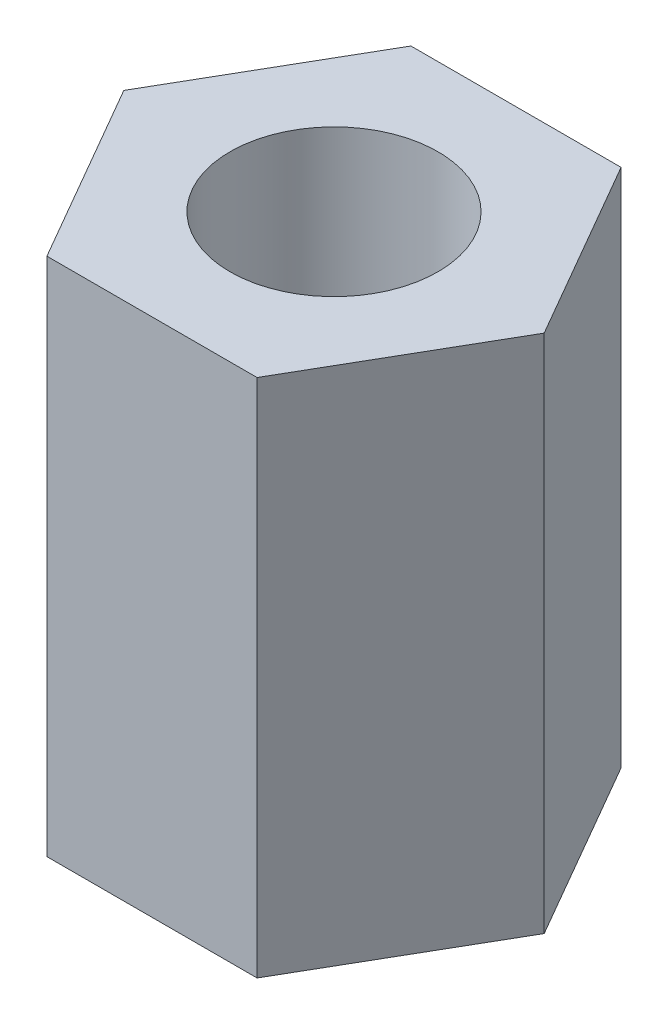
ISO-10303-21;
HEADER;
FILE_DESCRIPTION(('STEP AP214'),'2;1');
FILE_NAME('part.step','',(''),(''),'','','');
FILE_SCHEMA(('AUTOMOTIVE_DESIGN { 1 0 10303 214 1 1 1 1 }'));
ENDSEC;
DATA;
#1=APPLICATION_CONTEXT('core data for automotive mechanical design processes');
#2=APPLICATION_PROTOCOL_DEFINITION('international standard','automotive_design',2000,#1);
#3=PRODUCT_CONTEXT('',#1,'mechanical');
#4=PRODUCT('Part','Part','',(#3));
#5=PRODUCT_RELATED_PRODUCT_CATEGORY('part','',(#4));
#6=PRODUCT_DEFINITION_FORMATION('','',#4);
#7=PRODUCT_DEFINITION_CONTEXT('part definition',#1,'design');
#8=PRODUCT_DEFINITION('design','',#6,#7);
#9=PRODUCT_DEFINITION_SHAPE('','',#8);
#10=(LENGTH_UNIT() NAMED_UNIT(*) SI_UNIT(.MILLI.,.METRE.));
#11=(NAMED_UNIT(*) PLANE_ANGLE_UNIT() SI_UNIT($,.RADIAN.));
#12=(NAMED_UNIT(*) SI_UNIT($,.STERADIAN.) SOLID_ANGLE_UNIT());
#13=UNCERTAINTY_MEASURE_WITH_UNIT(LENGTH_MEASURE(1.E-05),#10,'distance_accuracy_value','');
#14=(GEOMETRIC_REPRESENTATION_CONTEXT(3) GLOBAL_UNCERTAINTY_ASSIGNED_CONTEXT((#13)) GLOBAL_UNIT_ASSIGNED_CONTEXT((#10,
#11,#12)) REPRESENTATION_CONTEXT('',''));
#15=CARTESIAN_POINT('',(0.,0.,0.));
#16=DIRECTION('',(0.,0.,1.));
#17=DIRECTION('',(1.,0.,0.));
#18=AXIS2_PLACEMENT_3D('',#15,#16,#17);
#19=CARTESIAN_POINT('',(0.,10.,0.));
#20=DIRECTION('',(0.,1.,0.));
#21=DIRECTION('',(0.,0.,1.));
#22=AXIS2_PLACEMENT_3D('',#19,#20,#21);
#23=PLANE('',#22);
#24=DIRECTION('',(0.5,0.,-0.866025403784439));
#25=VECTOR('',#24,1.);
#26=CARTESIAN_POINT('',(2.02072594216369,10.,3.5));
#27=LINE('',#26,#25);
#28=CARTESIAN_POINT('',(2.02072594216369,10.,3.5));
#29=VERTEX_POINT('',#28);
#30=CARTESIAN_POINT('',(4.04145188432738,10.,0.));
#31=VERTEX_POINT('',#30);
#32=EDGE_CURVE('E131',#29,#31,#27,.T.);
#33=ORIENTED_EDGE('',*,*,#32,.T.);
#34=DIRECTION('',(-0.5,0.,-0.866025403784439));
#35=VECTOR('',#34,1.);
#36=CARTESIAN_POINT('',(4.04145188432738,10.,0.));
#37=LINE('',#36,#35);
#38=CARTESIAN_POINT('',(2.02072594216369,10.,-3.5));
#39=VERTEX_POINT('',#38);
#40=EDGE_CURVE('E89',#31,#39,#37,.T.);
#41=ORIENTED_EDGE('',*,*,#40,.T.);
#42=DIRECTION('',(-1.,0.,0.));
#43=VECTOR('',#42,1.);
#44=CARTESIAN_POINT('',(2.02072594216369,10.,-3.5));
#45=LINE('',#44,#43);
#46=CARTESIAN_POINT('',(-2.02072594216369,10.,-3.5));
#47=VERTEX_POINT('',#46);
#48=EDGE_CURVE('E102',#39,#47,#45,.T.);
#49=ORIENTED_EDGE('',*,*,#48,.T.);
#50=DIRECTION('',(-0.5,0.,0.866025403784439));
#51=VECTOR('',#50,1.);
#52=CARTESIAN_POINT('',(-2.02072594216369,10.,-3.5));
#53=LINE('',#52,#51);
#54=CARTESIAN_POINT('',(-4.04145188432738,10.,0.));
#55=VERTEX_POINT('',#54);
#56=EDGE_CURVE('E96',#47,#55,#53,.T.);
#57=ORIENTED_EDGE('',*,*,#56,.T.);
#58=DIRECTION('',(0.5,0.,0.866025403784439));
#59=VECTOR('',#58,1.);
#60=CARTESIAN_POINT('',(-4.04145188432738,10.,0.));
#61=LINE('',#60,#59);
#62=CARTESIAN_POINT('',(-2.02072594216369,10.,3.5));
#63=VERTEX_POINT('',#62);
#64=EDGE_CURVE('E100',#55,#63,#61,.T.);
#65=ORIENTED_EDGE('',*,*,#64,.T.);
#66=DIRECTION('',(1.,0.,0.));
#67=VECTOR('',#66,1.);
#68=CARTESIAN_POINT('',(-2.02072594216369,10.,3.5));
#69=LINE('',#68,#67);
#70=EDGE_CURVE('E52',#63,#29,#69,.T.);
#71=ORIENTED_EDGE('',*,*,#70,.T.);
#72=EDGE_LOOP('',(#33,#41,#49,#57,#65,#71));
#73=FACE_BOUND('',#72,.T.);
#74=CARTESIAN_POINT('',(0.,10.,0.));
#75=DIRECTION('',(0.,1.,0.));
#76=DIRECTION('',(0.,0.,1.));
#77=AXIS2_PLACEMENT_3D('',#74,#75,#76);
#78=CIRCLE('',#77,2.);
#79=CARTESIAN_POINT('',(0.,10.,2.));
#80=VERTEX_POINT('',#79);
#81=EDGE_CURVE('E124',#80,#80,#78,.T.);
#82=ORIENTED_EDGE('',*,*,#81,.F.);
#83=EDGE_LOOP('',(#82));
#84=FACE_BOUND('',#83,.T.);
#85=ADVANCED_FACE('F35',(#73,#84),#23,.T.);
#86=CARTESIAN_POINT('',(0.,0.,0.));
#87=DIRECTION('',(0.,1.,0.));
#88=DIRECTION('',(0.,0.,1.));
#89=AXIS2_PLACEMENT_3D('',#86,#87,#88);
#90=PLANE('',#89);
#91=DIRECTION('',(0.5,0.,-0.866025403784439));
#92=VECTOR('',#91,1.);
#93=CARTESIAN_POINT('',(2.02072594216369,0.,3.5));
#94=LINE('',#93,#92);
#95=CARTESIAN_POINT('',(2.02072594216369,0.,3.5));
#96=VERTEX_POINT('',#95);
#97=CARTESIAN_POINT('',(4.04145188432738,0.,0.));
#98=VERTEX_POINT('',#97);
#99=EDGE_CURVE('E120',#96,#98,#94,.T.);
#100=ORIENTED_EDGE('',*,*,#99,.F.);
#101=DIRECTION('',(1.,0.,0.));
#102=VECTOR('',#101,1.);
#103=CARTESIAN_POINT('',(-2.02072594216369,0.,3.5));
#104=LINE('',#103,#102);
#105=CARTESIAN_POINT('',(-2.02072594216369,0.,3.5));
#106=VERTEX_POINT('',#105);
#107=EDGE_CURVE('E81',#106,#96,#104,.T.);
#108=ORIENTED_EDGE('',*,*,#107,.F.);
#109=DIRECTION('',(0.5,0.,0.866025403784439));
#110=VECTOR('',#109,1.);
#111=CARTESIAN_POINT('',(-4.04145188432738,0.,0.));
#112=LINE('',#111,#110);
#113=CARTESIAN_POINT('',(-4.04145188432738,0.,0.));
#114=VERTEX_POINT('',#113);
#115=EDGE_CURVE('E75',#114,#106,#112,.T.);
#116=ORIENTED_EDGE('',*,*,#115,.F.);
#117=DIRECTION('',(-0.5,0.,0.866025403784439));
#118=VECTOR('',#117,1.);
#119=CARTESIAN_POINT('',(-2.02072594216369,0.,-3.5));
#120=LINE('',#119,#118);
#121=CARTESIAN_POINT('',(-2.02072594216369,0.,-3.5));
#122=VERTEX_POINT('',#121);
#123=EDGE_CURVE('E110',#122,#114,#120,.T.);
#124=ORIENTED_EDGE('',*,*,#123,.F.);
#125=DIRECTION('',(-1.,0.,0.));
#126=VECTOR('',#125,1.);
#127=CARTESIAN_POINT('',(2.02072594216369,0.,-3.5));
#128=LINE('',#127,#126);
#129=CARTESIAN_POINT('',(2.02072594216369,0.,-3.5));
#130=VERTEX_POINT('',#129);
#131=EDGE_CURVE('E126',#130,#122,#128,.T.);
#132=ORIENTED_EDGE('',*,*,#131,.F.);
#133=DIRECTION('',(-0.5,0.,-0.866025403784439));
#134=VECTOR('',#133,1.);
#135=CARTESIAN_POINT('',(4.04145188432738,0.,0.));
#136=LINE('',#135,#134);
#137=EDGE_CURVE('E123',#98,#130,#136,.T.);
#138=ORIENTED_EDGE('',*,*,#137,.F.);
#139=EDGE_LOOP('',(#100,#108,#116,#124,#132,#138));
#140=FACE_BOUND('',#139,.T.);
#141=CARTESIAN_POINT('',(0.,0.,0.));
#142=DIRECTION('',(0.,1.,0.));
#143=DIRECTION('',(0.,0.,1.));
#144=AXIS2_PLACEMENT_3D('',#141,#142,#143);
#145=CIRCLE('',#144,2.);
#146=CARTESIAN_POINT('',(0.,0.,2.));
#147=VERTEX_POINT('',#146);
#148=EDGE_CURVE('E224',#147,#147,#145,.T.);
#149=ORIENTED_EDGE('',*,*,#148,.T.);
#150=EDGE_LOOP('',(#149));
#151=FACE_BOUND('',#150,.T.);
#152=ADVANCED_FACE('F140',(#140,#151),#90,.F.);
#153=CARTESIAN_POINT('',(2.02072594216369,10.,3.5));
#154=DIRECTION('',(-0.866025403784439,0.,-0.5));
#155=DIRECTION('',(-0.5,0.,0.866025403784439));
#156=AXIS2_PLACEMENT_3D('',#153,#154,#155);
#157=PLANE('',#156);
#158=ORIENTED_EDGE('',*,*,#99,.T.);
#159=DIRECTION('',(0.,-1.,0.));
#160=VECTOR('',#159,1.);
#161=CARTESIAN_POINT('',(4.04145188432738,10.,0.));
#162=LINE('',#161,#160);
#163=EDGE_CURVE('E11',#31,#98,#162,.T.);
#164=ORIENTED_EDGE('',*,*,#163,.F.);
#165=ORIENTED_EDGE('',*,*,#32,.F.);
#166=DIRECTION('',(0.,-1.,0.));
#167=VECTOR('',#166,1.);
#168=CARTESIAN_POINT('',(2.02072594216369,10.,3.5));
#169=LINE('',#168,#167);
#170=EDGE_CURVE('E116',#29,#96,#169,.T.);
#171=ORIENTED_EDGE('',*,*,#170,.T.);
#172=EDGE_LOOP('',(#158,#164,#165,#171));
#173=FACE_BOUND('',#172,.T.);
#174=ADVANCED_FACE('F37',(#173),#157,.F.);
#175=CARTESIAN_POINT('',(4.04145188432738,10.,0.));
#176=DIRECTION('',(-0.866025403784438,0.,0.5));
#177=DIRECTION('',(0.5,0.,0.866025403784438));
#178=AXIS2_PLACEMENT_3D('',#175,#176,#177);
#179=PLANE('',#178);
#180=ORIENTED_EDGE('',*,*,#137,.T.);
#181=DIRECTION('',(0.,-1.,0.));
#182=VECTOR('',#181,1.);
#183=CARTESIAN_POINT('',(2.02072594216369,10.,-3.5));
#184=LINE('',#183,#182);
#185=EDGE_CURVE('E44',#39,#130,#184,.T.);
#186=ORIENTED_EDGE('',*,*,#185,.F.);
#187=ORIENTED_EDGE('',*,*,#40,.F.);
#188=ORIENTED_EDGE('',*,*,#163,.T.);
#189=EDGE_LOOP('',(#180,#186,#187,#188));
#190=FACE_BOUND('',#189,.T.);
#191=ADVANCED_FACE('F165',(#190),#179,.F.);
#192=CARTESIAN_POINT('',(2.02072594216369,10.,-3.5));
#193=DIRECTION('',(0.,0.,1.));
#194=DIRECTION('',(1.,0.,0.));
#195=AXIS2_PLACEMENT_3D('',#192,#193,#194);
#196=PLANE('',#195);
#197=ORIENTED_EDGE('',*,*,#131,.T.);
#198=DIRECTION('',(0.,-1.,0.));
#199=VECTOR('',#198,1.);
#200=CARTESIAN_POINT('',(-2.02072594216369,10.,-3.5));
#201=LINE('',#200,#199);
#202=EDGE_CURVE('E111',#47,#122,#201,.T.);
#203=ORIENTED_EDGE('',*,*,#202,.F.);
#204=ORIENTED_EDGE('',*,*,#48,.F.);
#205=ORIENTED_EDGE('',*,*,#185,.T.);
#206=EDGE_LOOP('',(#197,#203,#204,#205));
#207=FACE_BOUND('',#206,.T.);
#208=ADVANCED_FACE('F137',(#207),#196,.F.);
#209=CARTESIAN_POINT('',(-2.02072594216369,10.,-3.5));
#210=DIRECTION('',(0.866025403784439,0.,0.5));
#211=DIRECTION('',(0.5,0.,-0.866025403784439));
#212=AXIS2_PLACEMENT_3D('',#209,#210,#211);
#213=PLANE('',#212);
#214=ORIENTED_EDGE('',*,*,#123,.T.);
#215=DIRECTION('',(0.,-1.,0.));
#216=VECTOR('',#215,1.);
#217=CARTESIAN_POINT('',(-4.04145188432738,10.,0.));
#218=LINE('',#217,#216);
#219=EDGE_CURVE('E107',#55,#114,#218,.T.);
#220=ORIENTED_EDGE('',*,*,#219,.F.);
#221=ORIENTED_EDGE('',*,*,#56,.F.);
#222=ORIENTED_EDGE('',*,*,#202,.T.);
#223=EDGE_LOOP('',(#214,#220,#221,#222));
#224=FACE_BOUND('',#223,.T.);
#225=ADVANCED_FACE('F108',(#224),#213,.F.);
#226=CARTESIAN_POINT('',(-4.04145188432738,10.,0.));
#227=DIRECTION('',(0.866025403784439,0.,-0.5));
#228=DIRECTION('',(-0.5,0.,-0.866025403784439));
#229=AXIS2_PLACEMENT_3D('',#226,#227,#228);
#230=PLANE('',#229);
#231=ORIENTED_EDGE('',*,*,#115,.T.);
#232=DIRECTION('',(0.,-1.,0.));
#233=VECTOR('',#232,1.);
#234=CARTESIAN_POINT('',(-2.02072594216369,10.,3.5));
#235=LINE('',#234,#233);
#236=EDGE_CURVE('E112',#63,#106,#235,.T.);
#237=ORIENTED_EDGE('',*,*,#236,.F.);
#238=ORIENTED_EDGE('',*,*,#64,.F.);
#239=ORIENTED_EDGE('',*,*,#219,.T.);
#240=EDGE_LOOP('',(#231,#237,#238,#239));
#241=FACE_BOUND('',#240,.T.);
#242=ADVANCED_FACE('F114',(#241),#230,.F.);
#243=CARTESIAN_POINT('',(-2.02072594216369,10.,3.5));
#244=DIRECTION('',(0.,0.,-1.));
#245=DIRECTION('',(-1.,0.,0.));
#246=AXIS2_PLACEMENT_3D('',#243,#244,#245);
#247=PLANE('',#246);
#248=ORIENTED_EDGE('',*,*,#107,.T.);
#249=ORIENTED_EDGE('',*,*,#170,.F.);
#250=ORIENTED_EDGE('',*,*,#70,.F.);
#251=ORIENTED_EDGE('',*,*,#236,.T.);
#252=EDGE_LOOP('',(#248,#249,#250,#251));
#253=FACE_BOUND('',#252,.T.);
#254=ADVANCED_FACE('F145',(#253),#247,.F.);
#255=CARTESIAN_POINT('',(0.,10.,0.));
#256=DIRECTION('',(0.,-1.,0.));
#257=DIRECTION('',(0.,0.,-1.));
#258=AXIS2_PLACEMENT_3D('',#255,#256,#257);
#259=CYLINDRICAL_SURFACE('',#258,2.);
#260=ORIENTED_EDGE('',*,*,#81,.T.);
#261=EDGE_LOOP('',(#260));
#262=FACE_BOUND('',#261,.T.);
#263=ORIENTED_EDGE('',*,*,#148,.F.);
#264=EDGE_LOOP('',(#263));
#265=FACE_BOUND('',#264,.T.);
#266=ADVANCED_FACE('F147',(#262,#265),#259,.F.);
#267=CLOSED_SHELL('',(#85,#152,#174,#191,#208,#225,#242,#254,#266));
#268=MANIFOLD_SOLID_BREP('B2',#267);
#269=ADVANCED_BREP_SHAPE_REPRESENTATION('',(#18,#268),#14);
#270=SHAPE_DEFINITION_REPRESENTATION(#9,#269);
ENDSEC;
END-ISO-10303-21;
